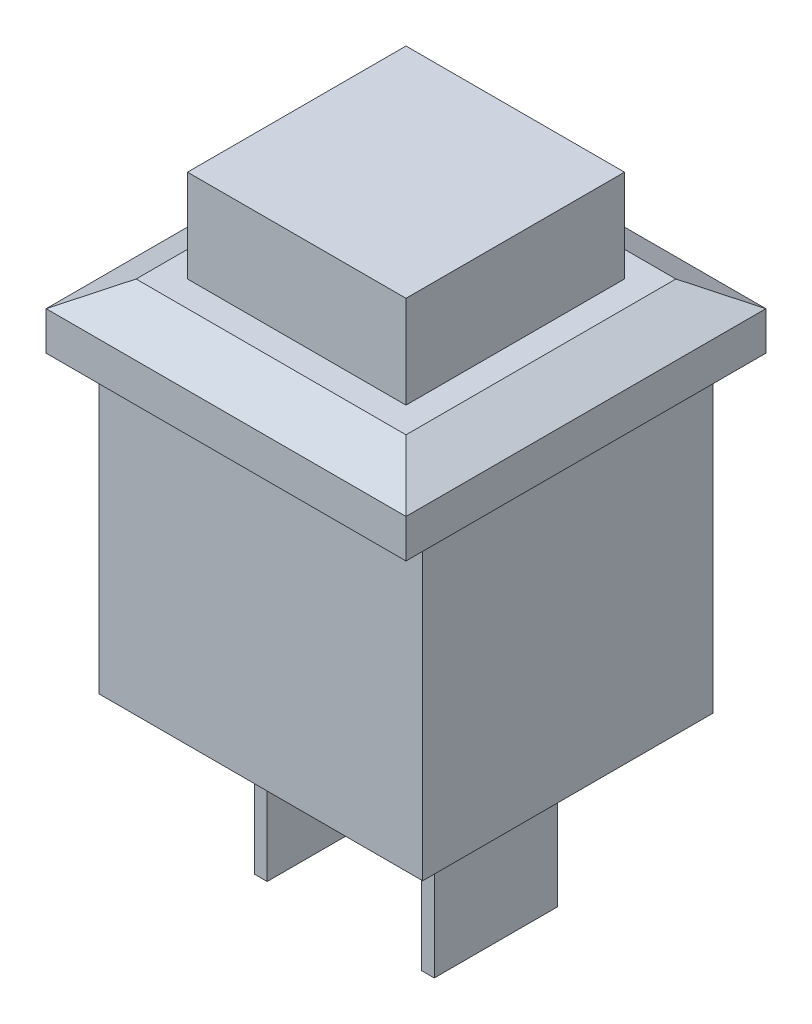
ISO-10303-21;
HEADER;
FILE_DESCRIPTION(('STEP AP214'),'2;1');
FILE_NAME('part.step','',(''),(''),'','','');
FILE_SCHEMA(('AUTOMOTIVE_DESIGN { 1 0 10303 214 1 1 1 1 }'));
ENDSEC;
DATA;
#1=APPLICATION_CONTEXT('core data for automotive mechanical design processes');
#2=APPLICATION_PROTOCOL_DEFINITION('international standard','automotive_design',2000,#1);
#3=PRODUCT_CONTEXT('',#1,'mechanical');
#4=PRODUCT('Part','Part','',(#3));
#5=PRODUCT_RELATED_PRODUCT_CATEGORY('part','',(#4));
#6=PRODUCT_DEFINITION_FORMATION('','',#4);
#7=PRODUCT_DEFINITION_CONTEXT('part definition',#1,'design');
#8=PRODUCT_DEFINITION('design','',#6,#7);
#9=PRODUCT_DEFINITION_SHAPE('','',#8);
#10=(LENGTH_UNIT() NAMED_UNIT(*) SI_UNIT(.MILLI.,.METRE.));
#11=(NAMED_UNIT(*) PLANE_ANGLE_UNIT() SI_UNIT($,.RADIAN.));
#12=(NAMED_UNIT(*) SI_UNIT($,.STERADIAN.) SOLID_ANGLE_UNIT());
#13=UNCERTAINTY_MEASURE_WITH_UNIT(LENGTH_MEASURE(1.E-05),#10,'distance_accuracy_value','');
#14=(GEOMETRIC_REPRESENTATION_CONTEXT(3) GLOBAL_UNCERTAINTY_ASSIGNED_CONTEXT((#13)) GLOBAL_UNIT_ASSIGNED_CONTEXT((#10,
#11,#12)) REPRESENTATION_CONTEXT('',''));
#15=CARTESIAN_POINT('',(0.,0.,0.));
#16=DIRECTION('',(0.,0.,1.));
#17=DIRECTION('',(1.,0.,0.));
#18=AXIS2_PLACEMENT_3D('',#15,#16,#17);
#19=CARTESIAN_POINT('',(4.25,6.1,-4.25));
#20=DIRECTION('',(-1.,0.,0.));
#21=DIRECTION('',(0.,0.,1.));
#22=AXIS2_PLACEMENT_3D('',#19,#20,#21);
#23=PLANE('',#22);
#24=DIRECTION('',(0.,0.,-1.));
#25=VECTOR('',#24,1.);
#26=CARTESIAN_POINT('',(4.25,2.5,-4.25));
#27=LINE('',#26,#25);
#28=CARTESIAN_POINT('',(4.25,2.5,4.25));
#29=VERTEX_POINT('',#28);
#30=CARTESIAN_POINT('',(4.25,2.5,-4.25));
#31=VERTEX_POINT('',#30);
#32=EDGE_CURVE('E105',#29,#31,#27,.T.);
#33=ORIENTED_EDGE('',*,*,#32,.T.);
#34=DIRECTION('',(0.,-1.,0.));
#35=VECTOR('',#34,1.);
#36=CARTESIAN_POINT('',(4.25,6.1,-4.25));
#37=LINE('',#36,#35);
#38=CARTESIAN_POINT('',(4.25,6.1,-4.25));
#39=VERTEX_POINT('',#38);
#40=EDGE_CURVE('E12',#39,#31,#37,.T.);
#41=ORIENTED_EDGE('',*,*,#40,.F.);
#42=DIRECTION('',(0.,0.,-1.));
#43=VECTOR('',#42,1.);
#44=CARTESIAN_POINT('',(4.25,6.1,-4.25));
#45=LINE('',#44,#43);
#46=CARTESIAN_POINT('',(4.25,6.1,4.25));
#47=VERTEX_POINT('',#46);
#48=EDGE_CURVE('E93',#47,#39,#45,.T.);
#49=ORIENTED_EDGE('',*,*,#48,.F.);
#50=DIRECTION('',(0.,-1.,0.));
#51=VECTOR('',#50,1.);
#52=CARTESIAN_POINT('',(4.25,6.1,4.25));
#53=LINE('',#52,#51);
#54=EDGE_CURVE('E101',#47,#29,#53,.T.);
#55=ORIENTED_EDGE('',*,*,#54,.T.);
#56=EDGE_LOOP('',(#33,#41,#49,#55));
#57=FACE_BOUND('',#56,.T.);
#58=ADVANCED_FACE('F42',(#57),#23,.F.);
#59=CARTESIAN_POINT('',(-4.25,6.1,-4.25));
#60=DIRECTION('',(0.,0.,1.));
#61=DIRECTION('',(1.,0.,0.));
#62=AXIS2_PLACEMENT_3D('',#59,#60,#61);
#63=PLANE('',#62);
#64=DIRECTION('',(-1.,0.,0.));
#65=VECTOR('',#64,1.);
#66=CARTESIAN_POINT('',(-4.25,2.5,-4.25));
#67=LINE('',#66,#65);
#68=CARTESIAN_POINT('',(-4.25,2.5,-4.25));
#69=VERTEX_POINT('',#68);
#70=EDGE_CURVE('E97',#31,#69,#67,.T.);
#71=ORIENTED_EDGE('',*,*,#70,.T.);
#72=DIRECTION('',(0.,-1.,0.));
#73=VECTOR('',#72,1.);
#74=CARTESIAN_POINT('',(-4.25,6.1,-4.25));
#75=LINE('',#74,#73);
#76=CARTESIAN_POINT('',(-4.25,6.1,-4.25));
#77=VERTEX_POINT('',#76);
#78=EDGE_CURVE('E50',#77,#69,#75,.T.);
#79=ORIENTED_EDGE('',*,*,#78,.F.);
#80=DIRECTION('',(-1.,0.,0.));
#81=VECTOR('',#80,1.);
#82=CARTESIAN_POINT('',(-4.25,6.1,-4.25));
#83=LINE('',#82,#81);
#84=EDGE_CURVE('E88',#39,#77,#83,.T.);
#85=ORIENTED_EDGE('',*,*,#84,.F.);
#86=ORIENTED_EDGE('',*,*,#40,.T.);
#87=EDGE_LOOP('',(#71,#79,#85,#86));
#88=FACE_BOUND('',#87,.T.);
#89=ADVANCED_FACE('F96',(#88),#63,.F.);
#90=CARTESIAN_POINT('',(-4.25,6.1,-4.25));
#91=DIRECTION('',(1.,0.,0.));
#92=DIRECTION('',(0.,0.,-1.));
#93=AXIS2_PLACEMENT_3D('',#90,#91,#92);
#94=PLANE('',#93);
#95=DIRECTION('',(0.,0.,1.));
#96=VECTOR('',#95,1.);
#97=CARTESIAN_POINT('',(-4.25,2.5,-4.25));
#98=LINE('',#97,#96);
#99=CARTESIAN_POINT('',(-4.25,2.5,4.25));
#100=VERTEX_POINT('',#99);
#101=EDGE_CURVE('E75',#69,#100,#98,.T.);
#102=ORIENTED_EDGE('',*,*,#101,.T.);
#103=DIRECTION('',(0.,-1.,0.));
#104=VECTOR('',#103,1.);
#105=CARTESIAN_POINT('',(-4.25,6.1,4.25));
#106=LINE('',#105,#104);
#107=CARTESIAN_POINT('',(-4.25,6.1,4.25));
#108=VERTEX_POINT('',#107);
#109=EDGE_CURVE('E98',#108,#100,#106,.T.);
#110=ORIENTED_EDGE('',*,*,#109,.F.);
#111=DIRECTION('',(0.,0.,1.));
#112=VECTOR('',#111,1.);
#113=CARTESIAN_POINT('',(-4.25,6.1,-4.25));
#114=LINE('',#113,#112);
#115=EDGE_CURVE('E91',#77,#108,#114,.T.);
#116=ORIENTED_EDGE('',*,*,#115,.F.);
#117=ORIENTED_EDGE('',*,*,#78,.T.);
#118=EDGE_LOOP('',(#102,#110,#116,#117));
#119=FACE_BOUND('',#118,.T.);
#120=ADVANCED_FACE('F99',(#119),#94,.F.);
#121=CARTESIAN_POINT('',(-4.25,6.1,4.25));
#122=DIRECTION('',(0.,0.,-1.));
#123=DIRECTION('',(-1.,0.,0.));
#124=AXIS2_PLACEMENT_3D('',#121,#122,#123);
#125=PLANE('',#124);
#126=DIRECTION('',(1.,0.,0.));
#127=VECTOR('',#126,1.);
#128=CARTESIAN_POINT('',(-4.25,2.5,4.25));
#129=LINE('',#128,#127);
#130=EDGE_CURVE('E81',#100,#29,#129,.T.);
#131=ORIENTED_EDGE('',*,*,#130,.T.);
#132=ORIENTED_EDGE('',*,*,#54,.F.);
#133=DIRECTION('',(1.,0.,0.));
#134=VECTOR('',#133,1.);
#135=CARTESIAN_POINT('',(-4.25,6.1,4.25));
#136=LINE('',#135,#134);
#137=EDGE_CURVE('E58',#108,#47,#136,.T.);
#138=ORIENTED_EDGE('',*,*,#137,.F.);
#139=ORIENTED_EDGE('',*,*,#109,.T.);
#140=EDGE_LOOP('',(#131,#132,#138,#139));
#141=FACE_BOUND('',#140,.T.);
#142=ADVANCED_FACE('F112',(#141),#125,.F.);
#143=CARTESIAN_POINT('',(0.,6.1,0.));
#144=DIRECTION('',(0.,1.,0.));
#145=DIRECTION('',(0.,0.,1.));
#146=AXIS2_PLACEMENT_3D('',#143,#144,#145);
#147=PLANE('',#146);
#148=ORIENTED_EDGE('',*,*,#48,.T.);
#149=ORIENTED_EDGE('',*,*,#84,.T.);
#150=ORIENTED_EDGE('',*,*,#115,.T.);
#151=ORIENTED_EDGE('',*,*,#137,.T.);
#152=EDGE_LOOP('',(#148,#149,#150,#151));
#153=FACE_BOUND('',#152,.T.);
#154=ADVANCED_FACE('F89',(#153),#147,.T.);
#155=CARTESIAN_POINT('',(0.,2.5,0.));
#156=DIRECTION('',(0.,1.,0.));
#157=DIRECTION('',(0.,0.,1.));
#158=AXIS2_PLACEMENT_3D('',#155,#156,#157);
#159=PLANE('',#158);
#160=ORIENTED_EDGE('',*,*,#32,.F.);
#161=ORIENTED_EDGE('',*,*,#130,.F.);
#162=ORIENTED_EDGE('',*,*,#101,.F.);
#163=ORIENTED_EDGE('',*,*,#70,.F.);
#164=EDGE_LOOP('',(#160,#161,#162,#163));
#165=FACE_BOUND('',#164,.T.);
#166=ADVANCED_FACE('F115',(#165),#159,.F.);
#167=CLOSED_SHELL('',(#58,#89,#120,#142,#154,#166));
#168=MANIFOLD_SOLID_BREP('B2',#167);
#169=CARTESIAN_POINT('',(0.,-11.8,0.));
#170=DIRECTION('',(0.,-1.,0.));
#171=DIRECTION('',(0.,0.,-1.));
#172=AXIS2_PLACEMENT_3D('',#169,#170,#171);
#173=PLANE('',#172);
#174=DIRECTION('',(-1.,0.,0.));
#175=VECTOR('',#174,1.);
#176=CARTESIAN_POINT('',(-3.5,-11.8,2.4));
#177=LINE('',#176,#175);
#178=CARTESIAN_POINT('',(-3.,-11.8,2.4));
#179=VERTEX_POINT('',#178);
#180=CARTESIAN_POINT('',(-3.5,-11.8,2.4));
#181=VERTEX_POINT('',#180);
#182=EDGE_CURVE('E320',#179,#181,#177,.T.);
#183=ORIENTED_EDGE('',*,*,#182,.F.);
#184=DIRECTION('',(0.,0.,1.));
#185=VECTOR('',#184,1.);
#186=CARTESIAN_POINT('',(-3.,-11.8,-2.4));
#187=LINE('',#186,#185);
#188=CARTESIAN_POINT('',(-3.,-11.8,-2.4));
#189=VERTEX_POINT('',#188);
#190=EDGE_CURVE('E317',#189,#179,#187,.T.);
#191=ORIENTED_EDGE('',*,*,#190,.F.);
#192=DIRECTION('',(1.,0.,0.));
#193=VECTOR('',#192,1.);
#194=CARTESIAN_POINT('',(-3.5,-11.8,-2.4));
#195=LINE('',#194,#193);
#196=CARTESIAN_POINT('',(-3.5,-11.8,-2.4));
#197=VERTEX_POINT('',#196);
#198=EDGE_CURVE('E329',#197,#189,#195,.T.);
#199=ORIENTED_EDGE('',*,*,#198,.F.);
#200=DIRECTION('',(0.,0.,-1.));
#201=VECTOR('',#200,1.);
#202=CARTESIAN_POINT('',(-3.5,-11.8,-2.4));
#203=LINE('',#202,#201);
#204=EDGE_CURVE('E337',#181,#197,#203,.T.);
#205=ORIENTED_EDGE('',*,*,#204,.F.);
#206=EDGE_LOOP('',(#183,#191,#199,#205));
#207=FACE_BOUND('',#206,.T.);
#208=DIRECTION('',(0.,0.,-1.));
#209=VECTOR('',#208,1.);
#210=CARTESIAN_POINT('',(-6.3,-11.8,-5.65));
#211=LINE('',#210,#209);
#212=CARTESIAN_POINT('',(-6.3,-11.8,5.65));
#213=VERTEX_POINT('',#212);
#214=CARTESIAN_POINT('',(-6.3,-11.8,-5.65));
#215=VERTEX_POINT('',#214);
#216=EDGE_CURVE('E349',#213,#215,#211,.T.);
#217=ORIENTED_EDGE('',*,*,#216,.T.);
#218=DIRECTION('',(1.,0.,0.));
#219=VECTOR('',#218,1.);
#220=CARTESIAN_POINT('',(6.3,-11.8,-5.65));
#221=LINE('',#220,#219);
#222=CARTESIAN_POINT('',(6.3,-11.8,-5.65));
#223=VERTEX_POINT('',#222);
#224=EDGE_CURVE('E352',#215,#223,#221,.T.);
#225=ORIENTED_EDGE('',*,*,#224,.T.);
#226=DIRECTION('',(0.,0.,1.));
#227=VECTOR('',#226,1.);
#228=CARTESIAN_POINT('',(6.3,-11.8,-5.65));
#229=LINE('',#228,#227);
#230=CARTESIAN_POINT('',(6.3,-11.8,5.65));
#231=VERTEX_POINT('',#230);
#232=EDGE_CURVE('E355',#223,#231,#229,.T.);
#233=ORIENTED_EDGE('',*,*,#232,.T.);
#234=DIRECTION('',(-1.,0.,0.));
#235=VECTOR('',#234,1.);
#236=CARTESIAN_POINT('',(6.3,-11.8,5.65));
#237=LINE('',#236,#235);
#238=EDGE_CURVE('E357',#231,#213,#237,.T.);
#239=ORIENTED_EDGE('',*,*,#238,.T.);
#240=EDGE_LOOP('',(#217,#225,#233,#239));
#241=FACE_BOUND('',#240,.T.);
#242=DIRECTION('',(0.,0.,1.));
#243=VECTOR('',#242,1.);
#244=CARTESIAN_POINT('',(3.5,-11.8,-2.4));
#245=LINE('',#244,#243);
#246=CARTESIAN_POINT('',(3.5,-11.8,-2.4));
#247=VERTEX_POINT('',#246);
#248=CARTESIAN_POINT('',(3.5,-11.8,2.4));
#249=VERTEX_POINT('',#248);
#250=EDGE_CURVE('E510',#247,#249,#245,.T.);
#251=ORIENTED_EDGE('',*,*,#250,.F.);
#252=DIRECTION('',(1.,0.,0.));
#253=VECTOR('',#252,1.);
#254=CARTESIAN_POINT('',(3.5,-11.8,-2.4));
#255=LINE('',#254,#253);
#256=CARTESIAN_POINT('',(3.,-11.8,-2.4));
#257=VERTEX_POINT('',#256);
#258=EDGE_CURVE('E315',#257,#247,#255,.T.);
#259=ORIENTED_EDGE('',*,*,#258,.F.);
#260=DIRECTION('',(0.,0.,-1.));
#261=VECTOR('',#260,1.);
#262=CARTESIAN_POINT('',(3.,-11.8,-2.4));
#263=LINE('',#262,#261);
#264=CARTESIAN_POINT('',(3.,-11.8,2.4));
#265=VERTEX_POINT('',#264);
#266=EDGE_CURVE('E311',#265,#257,#263,.T.);
#267=ORIENTED_EDGE('',*,*,#266,.F.);
#268=DIRECTION('',(-1.,0.,0.));
#269=VECTOR('',#268,1.);
#270=CARTESIAN_POINT('',(3.5,-11.8,2.4));
#271=LINE('',#270,#269);
#272=EDGE_CURVE('E512',#249,#265,#271,.T.);
#273=ORIENTED_EDGE('',*,*,#272,.F.);
#274=EDGE_LOOP('',(#251,#259,#267,#273));
#275=FACE_BOUND('',#274,.T.);
#276=ADVANCED_FACE('F165',(#207,#241,#275),#173,.T.);
#277=CARTESIAN_POINT('',(0.,0.,0.));
#278=DIRECTION('',(0.,-1.,0.));
#279=DIRECTION('',(0.,0.,-1.));
#280=AXIS2_PLACEMENT_3D('',#277,#278,#279);
#281=PLANE('',#280);
#282=DIRECTION('',(0.,0.,-1.));
#283=VECTOR('',#282,1.);
#284=CARTESIAN_POINT('',(6.99999999999999,0.,7.));
#285=LINE('',#284,#283);
#286=CARTESIAN_POINT('',(6.99999999999999,0.,7.));
#287=VERTEX_POINT('',#286);
#288=CARTESIAN_POINT('',(6.99999999999999,0.,-7.));
#289=VERTEX_POINT('',#288);
#290=EDGE_CURVE('E378',#287,#289,#285,.T.);
#291=ORIENTED_EDGE('',*,*,#290,.F.);
#292=DIRECTION('',(1.,0.,0.));
#293=VECTOR('',#292,1.);
#294=CARTESIAN_POINT('',(-7.00000000000001,0.,7.));
#295=LINE('',#294,#293);
#296=CARTESIAN_POINT('',(-7.00000000000001,0.,7.));
#297=VERTEX_POINT('',#296);
#298=EDGE_CURVE('E387',#297,#287,#295,.T.);
#299=ORIENTED_EDGE('',*,*,#298,.F.);
#300=DIRECTION('',(0.,0.,1.));
#301=VECTOR('',#300,1.);
#302=CARTESIAN_POINT('',(-7.00000000000001,0.,7.));
#303=LINE('',#302,#301);
#304=CARTESIAN_POINT('',(-7.00000000000001,0.,-7.));
#305=VERTEX_POINT('',#304);
#306=EDGE_CURVE('E384',#305,#297,#303,.T.);
#307=ORIENTED_EDGE('',*,*,#306,.F.);
#308=DIRECTION('',(-1.,0.,0.));
#309=VECTOR('',#308,1.);
#310=CARTESIAN_POINT('',(-7.00000000000001,0.,-7.));
#311=LINE('',#310,#309);
#312=EDGE_CURVE('E381',#289,#305,#311,.T.);
#313=ORIENTED_EDGE('',*,*,#312,.F.);
#314=EDGE_LOOP('',(#291,#299,#307,#313));
#315=FACE_BOUND('',#314,.T.);
#316=DIRECTION('',(1.,0.,0.));
#317=VECTOR('',#316,1.);
#318=CARTESIAN_POINT('',(6.3,0.,-5.65));
#319=LINE('',#318,#317);
#320=CARTESIAN_POINT('',(-6.3,0.,-5.65));
#321=VERTEX_POINT('',#320);
#322=CARTESIAN_POINT('',(6.3,0.,-5.65));
#323=VERTEX_POINT('',#322);
#324=EDGE_CURVE('E362',#321,#323,#319,.T.);
#325=ORIENTED_EDGE('',*,*,#324,.F.);
#326=DIRECTION('',(0.,0.,-1.));
#327=VECTOR('',#326,1.);
#328=CARTESIAN_POINT('',(-6.3,0.,-5.65));
#329=LINE('',#328,#327);
#330=CARTESIAN_POINT('',(-6.3,0.,5.65));
#331=VERTEX_POINT('',#330);
#332=EDGE_CURVE('E348',#331,#321,#329,.T.);
#333=ORIENTED_EDGE('',*,*,#332,.F.);
#334=DIRECTION('',(-1.,0.,0.));
#335=VECTOR('',#334,1.);
#336=CARTESIAN_POINT('',(6.3,0.,5.65));
#337=LINE('',#336,#335);
#338=CARTESIAN_POINT('',(6.3,0.,5.65));
#339=VERTEX_POINT('',#338);
#340=EDGE_CURVE('E353',#339,#331,#337,.T.);
#341=ORIENTED_EDGE('',*,*,#340,.F.);
#342=DIRECTION('',(0.,0.,1.));
#343=VECTOR('',#342,1.);
#344=CARTESIAN_POINT('',(6.3,0.,-5.65));
#345=LINE('',#344,#343);
#346=EDGE_CURVE('E364',#323,#339,#345,.T.);
#347=ORIENTED_EDGE('',*,*,#346,.F.);
#348=EDGE_LOOP('',(#325,#333,#341,#347));
#349=FACE_BOUND('',#348,.T.);
#350=ADVANCED_FACE('F442',(#315,#349),#281,.T.);
#351=CARTESIAN_POINT('',(6.99999999999999,2.5,7.));
#352=DIRECTION('',(-1.,0.,0.));
#353=DIRECTION('',(0.,0.,1.));
#354=AXIS2_PLACEMENT_3D('',#351,#352,#353);
#355=PLANE('',#354);
#356=DIRECTION('',(0.,-1.,0.));
#357=VECTOR('',#356,1.);
#358=CARTESIAN_POINT('',(6.99999999999999,2.5,-7.));
#359=LINE('',#358,#357);
#360=CARTESIAN_POINT('',(6.99999999999999,1.5,-7.));
#361=VERTEX_POINT('',#360);
#362=EDGE_CURVE('E396',#361,#289,#359,.T.);
#363=ORIENTED_EDGE('',*,*,#362,.F.);
#364=DIRECTION('',(0.,0.,1.));
#365=VECTOR('',#364,1.);
#366=CARTESIAN_POINT('',(6.99999999999999,1.5,7.));
#367=LINE('',#366,#365);
#368=CARTESIAN_POINT('',(6.99999999999999,1.5,7.));
#369=VERTEX_POINT('',#368);
#370=EDGE_CURVE('E40',#361,#369,#367,.T.);
#371=ORIENTED_EDGE('',*,*,#370,.T.);
#372=DIRECTION('',(0.,-1.,0.));
#373=VECTOR('',#372,1.);
#374=CARTESIAN_POINT('',(6.99999999999999,2.5,7.));
#375=LINE('',#374,#373);
#376=EDGE_CURVE('E390',#369,#287,#375,.T.);
#377=ORIENTED_EDGE('',*,*,#376,.T.);
#378=ORIENTED_EDGE('',*,*,#290,.T.);
#379=EDGE_LOOP('',(#363,#371,#377,#378));
#380=FACE_BOUND('',#379,.T.);
#381=ADVANCED_FACE('F437',(#380),#355,.F.);
#382=CARTESIAN_POINT('',(-7.00000000000001,2.5,-7.));
#383=DIRECTION('',(0.,0.,1.));
#384=DIRECTION('',(1.,0.,0.));
#385=AXIS2_PLACEMENT_3D('',#382,#383,#384);
#386=PLANE('',#385);
#387=DIRECTION('',(0.,-1.,0.));
#388=VECTOR('',#387,1.);
#389=CARTESIAN_POINT('',(-7.00000000000001,2.5,-7.));
#390=LINE('',#389,#388);
#391=CARTESIAN_POINT('',(-7.00000000000001,1.5,-7.));
#392=VERTEX_POINT('',#391);
#393=EDGE_CURVE('E394',#392,#305,#390,.T.);
#394=ORIENTED_EDGE('',*,*,#393,.F.);
#395=DIRECTION('',(1.,0.,0.));
#396=VECTOR('',#395,1.);
#397=CARTESIAN_POINT('',(-7.00000000000001,1.5,-7.));
#398=LINE('',#397,#396);
#399=EDGE_CURVE('E174',#392,#361,#398,.T.);
#400=ORIENTED_EDGE('',*,*,#399,.T.);
#401=ORIENTED_EDGE('',*,*,#362,.T.);
#402=ORIENTED_EDGE('',*,*,#312,.T.);
#403=EDGE_LOOP('',(#394,#400,#401,#402));
#404=FACE_BOUND('',#403,.T.);
#405=ADVANCED_FACE('F434',(#404),#386,.F.);
#406=CARTESIAN_POINT('',(-7.00000000000001,2.5,7.));
#407=DIRECTION('',(1.,0.,0.));
#408=DIRECTION('',(0.,0.,-1.));
#409=AXIS2_PLACEMENT_3D('',#406,#407,#408);
#410=PLANE('',#409);
#411=DIRECTION('',(0.,-1.,0.));
#412=VECTOR('',#411,1.);
#413=CARTESIAN_POINT('',(-7.00000000000001,2.5,7.));
#414=LINE('',#413,#412);
#415=CARTESIAN_POINT('',(-7.00000000000001,1.5,7.));
#416=VERTEX_POINT('',#415);
#417=EDGE_CURVE('E392',#416,#297,#414,.T.);
#418=ORIENTED_EDGE('',*,*,#417,.F.);
#419=DIRECTION('',(0.,0.,-1.));
#420=VECTOR('',#419,1.);
#421=CARTESIAN_POINT('',(-7.00000000000001,1.5,7.));
#422=LINE('',#421,#420);
#423=EDGE_CURVE('E410',#416,#392,#422,.T.);
#424=ORIENTED_EDGE('',*,*,#423,.T.);
#425=ORIENTED_EDGE('',*,*,#393,.T.);
#426=ORIENTED_EDGE('',*,*,#306,.T.);
#427=EDGE_LOOP('',(#418,#424,#425,#426));
#428=FACE_BOUND('',#427,.T.);
#429=ADVANCED_FACE('F447',(#428),#410,.F.);
#430=CARTESIAN_POINT('',(-7.00000000000001,2.5,7.));
#431=DIRECTION('',(0.,0.,-1.));
#432=DIRECTION('',(-1.,0.,0.));
#433=AXIS2_PLACEMENT_3D('',#430,#431,#432);
#434=PLANE('',#433);
#435=ORIENTED_EDGE('',*,*,#376,.F.);
#436=DIRECTION('',(-1.,0.,0.));
#437=VECTOR('',#436,1.);
#438=CARTESIAN_POINT('',(-7.00000000000001,1.5,7.));
#439=LINE('',#438,#437);
#440=EDGE_CURVE('E407',#369,#416,#439,.T.);
#441=ORIENTED_EDGE('',*,*,#440,.T.);
#442=ORIENTED_EDGE('',*,*,#417,.T.);
#443=ORIENTED_EDGE('',*,*,#298,.T.);
#444=EDGE_LOOP('',(#435,#441,#442,#443));
#445=FACE_BOUND('',#444,.T.);
#446=ADVANCED_FACE('F449',(#445),#434,.F.);
#447=CARTESIAN_POINT('',(0.,2.5,0.));
#448=DIRECTION('',(0.,-1.,0.));
#449=DIRECTION('',(0.,0.,-1.));
#450=AXIS2_PLACEMENT_3D('',#447,#448,#449);
#451=PLANE('',#450);
#452=DIRECTION('',(0.,0.,1.));
#453=VECTOR('',#452,1.);
#454=CARTESIAN_POINT('',(-5.24999999999999,2.5,0.));
#455=LINE('',#454,#453);
#456=CARTESIAN_POINT('',(-5.24999999999999,2.5,-5.24999999999999));
#457=VERTEX_POINT('',#456);
#458=CARTESIAN_POINT('',(-5.24999999999999,2.5,5.24999999999999));
#459=VERTEX_POINT('',#458);
#460=EDGE_CURVE('E402',#457,#459,#455,.T.);
#461=ORIENTED_EDGE('',*,*,#460,.T.);
#462=DIRECTION('',(1.,0.,0.));
#463=VECTOR('',#462,1.);
#464=CARTESIAN_POINT('',(0.,2.5,5.24999999999999));
#465=LINE('',#464,#463);
#466=CARTESIAN_POINT('',(5.24999999999998,2.5,5.24999999999999));
#467=VERTEX_POINT('',#466);
#468=EDGE_CURVE('E404',#459,#467,#465,.T.);
#469=ORIENTED_EDGE('',*,*,#468,.T.);
#470=DIRECTION('',(0.,0.,-1.));
#471=VECTOR('',#470,1.);
#472=CARTESIAN_POINT('',(5.24999999999998,2.5,0.));
#473=LINE('',#472,#471);
#474=CARTESIAN_POINT('',(5.24999999999998,2.5,-5.24999999999999));
#475=VERTEX_POINT('',#474);
#476=EDGE_CURVE('E398',#467,#475,#473,.T.);
#477=ORIENTED_EDGE('',*,*,#476,.T.);
#478=DIRECTION('',(-1.,0.,0.));
#479=VECTOR('',#478,1.);
#480=CARTESIAN_POINT('',(0.,2.5,-5.24999999999999));
#481=LINE('',#480,#479);
#482=EDGE_CURVE('E400',#475,#457,#481,.T.);
#483=ORIENTED_EDGE('',*,*,#482,.T.);
#484=EDGE_LOOP('',(#461,#469,#477,#483));
#485=FACE_BOUND('',#484,.T.);
#486=ADVANCED_FACE('F457',(#485),#451,.F.);
#487=CARTESIAN_POINT('',(0.,2.5,-5.24999999999999));
#488=DIRECTION('',(0.,-0.86824314212446,0.496138938356833));
#489=DIRECTION('',(-1.,0.,0.));
#490=AXIS2_PLACEMENT_3D('',#487,#488,#489);
#491=PLANE('',#490);
#492=DIRECTION('',(-0.655610068107186,0.374634324632677,0.655610068107186));
#493=VECTOR('',#492,1.);
#494=CARTESIAN_POINT('',(2.99342105263157,3.78947368421052,-2.99342105263157));
#495=LINE('',#494,#493);
#496=EDGE_CURVE('E415',#361,#475,#495,.T.);
#497=ORIENTED_EDGE('',*,*,#496,.F.);
#498=ORIENTED_EDGE('',*,*,#399,.F.);
#499=DIRECTION('',(0.655610068107186,0.374634324632677,0.655610068107186));
#500=VECTOR('',#499,1.);
#501=CARTESIAN_POINT('',(-2.99342105263157,3.78947368421052,-2.99342105263157));
#502=LINE('',#501,#500);
#503=EDGE_CURVE('E169',#457,#392,#502,.F.);
#504=ORIENTED_EDGE('',*,*,#503,.F.);
#505=ORIENTED_EDGE('',*,*,#482,.F.);
#506=EDGE_LOOP('',(#497,#498,#504,#505));
#507=FACE_BOUND('',#506,.T.);
#508=ADVANCED_FACE('F167',(#507),#491,.F.);
#509=CARTESIAN_POINT('',(-5.24999999999999,2.5,0.));
#510=DIRECTION('',(0.496138938356833,-0.86824314212446,0.));
#511=DIRECTION('',(0.,0.,1.));
#512=AXIS2_PLACEMENT_3D('',#509,#510,#511);
#513=PLANE('',#512);
#514=ORIENTED_EDGE('',*,*,#503,.T.);
#515=ORIENTED_EDGE('',*,*,#423,.F.);
#516=DIRECTION('',(0.655610068107186,0.374634324632677,-0.655610068107186));
#517=VECTOR('',#516,1.);
#518=CARTESIAN_POINT('',(-2.99342105263158,3.78947368421052,2.99342105263157));
#519=LINE('',#518,#517);
#520=EDGE_CURVE('E414',#459,#416,#519,.F.);
#521=ORIENTED_EDGE('',*,*,#520,.F.);
#522=ORIENTED_EDGE('',*,*,#460,.F.);
#523=EDGE_LOOP('',(#514,#515,#521,#522));
#524=FACE_BOUND('',#523,.T.);
#525=ADVANCED_FACE('F426',(#524),#513,.F.);
#526=CARTESIAN_POINT('',(5.24999999999998,2.5,0.));
#527=DIRECTION('',(-0.496138938356833,-0.86824314212446,0.));
#528=DIRECTION('',(0.,0.,-1.));
#529=AXIS2_PLACEMENT_3D('',#526,#527,#528);
#530=PLANE('',#529);
#531=ORIENTED_EDGE('',*,*,#496,.T.);
#532=ORIENTED_EDGE('',*,*,#476,.F.);
#533=DIRECTION('',(0.655610068107186,-0.374634324632677,0.655610068107186));
#534=VECTOR('',#533,1.);
#535=CARTESIAN_POINT('',(2.99342105263157,3.78947368421052,2.99342105263157));
#536=LINE('',#535,#534);
#537=EDGE_CURVE('E377',#369,#467,#536,.F.);
#538=ORIENTED_EDGE('',*,*,#537,.F.);
#539=ORIENTED_EDGE('',*,*,#370,.F.);
#540=EDGE_LOOP('',(#531,#532,#538,#539));
#541=FACE_BOUND('',#540,.T.);
#542=ADVANCED_FACE('F455',(#541),#530,.F.);
#543=CARTESIAN_POINT('',(0.,2.5,5.24999999999999));
#544=DIRECTION('',(0.,-0.86824314212446,-0.496138938356833));
#545=DIRECTION('',(1.,0.,0.));
#546=AXIS2_PLACEMENT_3D('',#543,#544,#545);
#547=PLANE('',#546);
#548=ORIENTED_EDGE('',*,*,#520,.T.);
#549=ORIENTED_EDGE('',*,*,#440,.F.);
#550=ORIENTED_EDGE('',*,*,#537,.T.);
#551=ORIENTED_EDGE('',*,*,#468,.F.);
#552=EDGE_LOOP('',(#548,#549,#550,#551));
#553=FACE_BOUND('',#552,.T.);
#554=ADVANCED_FACE('F453',(#553),#547,.F.);
#555=CARTESIAN_POINT('',(-6.3,-11.8,-5.65));
#556=DIRECTION('',(1.,0.,0.));
#557=DIRECTION('',(0.,0.,-1.));
#558=AXIS2_PLACEMENT_3D('',#555,#556,#557);
#559=PLANE('',#558);
#560=ORIENTED_EDGE('',*,*,#332,.T.);
#561=DIRECTION('',(0.,1.,0.));
#562=VECTOR('',#561,1.);
#563=CARTESIAN_POINT('',(-6.3,-11.8,-5.65));
#564=LINE('',#563,#562);
#565=EDGE_CURVE('E375',#215,#321,#564,.T.);
#566=ORIENTED_EDGE('',*,*,#565,.F.);
#567=ORIENTED_EDGE('',*,*,#216,.F.);
#568=DIRECTION('',(0.,1.,0.));
#569=VECTOR('',#568,1.);
#570=CARTESIAN_POINT('',(-6.3,-11.8,5.65));
#571=LINE('',#570,#569);
#572=EDGE_CURVE('E359',#213,#331,#571,.T.);
#573=ORIENTED_EDGE('',*,*,#572,.T.);
#574=EDGE_LOOP('',(#560,#566,#567,#573));
#575=FACE_BOUND('',#574,.T.);
#576=ADVANCED_FACE('F489',(#575),#559,.F.);
#577=CARTESIAN_POINT('',(6.3,-11.8,-5.65));
#578=DIRECTION('',(0.,0.,1.));
#579=DIRECTION('',(1.,0.,0.));
#580=AXIS2_PLACEMENT_3D('',#577,#578,#579);
#581=PLANE('',#580);
#582=ORIENTED_EDGE('',*,*,#324,.T.);
#583=DIRECTION('',(0.,1.,0.));
#584=VECTOR('',#583,1.);
#585=CARTESIAN_POINT('',(6.3,-11.8,-5.65));
#586=LINE('',#585,#584);
#587=EDGE_CURVE('E372',#223,#323,#586,.T.);
#588=ORIENTED_EDGE('',*,*,#587,.F.);
#589=ORIENTED_EDGE('',*,*,#224,.F.);
#590=ORIENTED_EDGE('',*,*,#565,.T.);
#591=EDGE_LOOP('',(#582,#588,#589,#590));
#592=FACE_BOUND('',#591,.T.);
#593=ADVANCED_FACE('F486',(#592),#581,.F.);
#594=CARTESIAN_POINT('',(6.3,-11.8,-5.65));
#595=DIRECTION('',(-1.,0.,0.));
#596=DIRECTION('',(0.,0.,1.));
#597=AXIS2_PLACEMENT_3D('',#594,#595,#596);
#598=PLANE('',#597);
#599=ORIENTED_EDGE('',*,*,#346,.T.);
#600=DIRECTION('',(0.,1.,0.));
#601=VECTOR('',#600,1.);
#602=CARTESIAN_POINT('',(6.3,-11.8,5.65));
#603=LINE('',#602,#601);
#604=EDGE_CURVE('E370',#231,#339,#603,.T.);
#605=ORIENTED_EDGE('',*,*,#604,.F.);
#606=ORIENTED_EDGE('',*,*,#232,.F.);
#607=ORIENTED_EDGE('',*,*,#587,.T.);
#608=EDGE_LOOP('',(#599,#605,#606,#607));
#609=FACE_BOUND('',#608,.T.);
#610=ADVANCED_FACE('F482',(#609),#598,.F.);
#611=CARTESIAN_POINT('',(6.3,-11.8,5.65));
#612=DIRECTION('',(0.,0.,-1.));
#613=DIRECTION('',(-1.,0.,0.));
#614=AXIS2_PLACEMENT_3D('',#611,#612,#613);
#615=PLANE('',#614);
#616=ORIENTED_EDGE('',*,*,#340,.T.);
#617=ORIENTED_EDGE('',*,*,#572,.F.);
#618=ORIENTED_EDGE('',*,*,#238,.F.);
#619=ORIENTED_EDGE('',*,*,#604,.T.);
#620=EDGE_LOOP('',(#616,#617,#618,#619));
#621=FACE_BOUND('',#620,.T.);
#622=ADVANCED_FACE('F479',(#621),#615,.F.);
#623=CARTESIAN_POINT('',(-3.,-18.1,-2.4));
#624=DIRECTION('',(-1.,0.,0.));
#625=DIRECTION('',(0.,0.,1.));
#626=AXIS2_PLACEMENT_3D('',#623,#624,#625);
#627=PLANE('',#626);
#628=ORIENTED_EDGE('',*,*,#190,.T.);
#629=DIRECTION('',(0.,1.,0.));
#630=VECTOR('',#629,1.);
#631=CARTESIAN_POINT('',(-3.,-18.1,2.4));
#632=LINE('',#631,#630);
#633=CARTESIAN_POINT('',(-3.,-18.1,2.4));
#634=VERTEX_POINT('',#633);
#635=EDGE_CURVE('E346',#634,#179,#632,.T.);
#636=ORIENTED_EDGE('',*,*,#635,.F.);
#637=DIRECTION('',(0.,0.,1.));
#638=VECTOR('',#637,1.);
#639=CARTESIAN_POINT('',(-3.,-18.1,-2.4));
#640=LINE('',#639,#638);
#641=CARTESIAN_POINT('',(-3.,-18.1,-2.4));
#642=VERTEX_POINT('',#641);
#643=EDGE_CURVE('E325',#642,#634,#640,.T.);
#644=ORIENTED_EDGE('',*,*,#643,.F.);
#645=DIRECTION('',(0.,1.,0.));
#646=VECTOR('',#645,1.);
#647=CARTESIAN_POINT('',(-3.,-18.1,-2.4));
#648=LINE('',#647,#646);
#649=EDGE_CURVE('E334',#642,#189,#648,.T.);
#650=ORIENTED_EDGE('',*,*,#649,.T.);
#651=EDGE_LOOP('',(#628,#636,#644,#650));
#652=FACE_BOUND('',#651,.T.);
#653=ADVANCED_FACE('F477',(#652),#627,.F.);
#654=CARTESIAN_POINT('',(-3.5,-18.1,2.4));
#655=DIRECTION('',(0.,0.,-1.));
#656=DIRECTION('',(-1.,0.,0.));
#657=AXIS2_PLACEMENT_3D('',#654,#655,#656);
#658=PLANE('',#657);
#659=ORIENTED_EDGE('',*,*,#182,.T.);
#660=DIRECTION('',(0.,1.,0.));
#661=VECTOR('',#660,1.);
#662=CARTESIAN_POINT('',(-3.5,-18.1,2.4));
#663=LINE('',#662,#661);
#664=CARTESIAN_POINT('',(-3.5,-18.1,2.4));
#665=VERTEX_POINT('',#664);
#666=EDGE_CURVE('E343',#665,#181,#663,.T.);
#667=ORIENTED_EDGE('',*,*,#666,.F.);
#668=DIRECTION('',(-1.,0.,0.));
#669=VECTOR('',#668,1.);
#670=CARTESIAN_POINT('',(-3.5,-18.1,2.4));
#671=LINE('',#670,#669);
#672=EDGE_CURVE('E328',#634,#665,#671,.T.);
#673=ORIENTED_EDGE('',*,*,#672,.F.);
#674=ORIENTED_EDGE('',*,*,#635,.T.);
#675=EDGE_LOOP('',(#659,#667,#673,#674));
#676=FACE_BOUND('',#675,.T.);
#677=ADVANCED_FACE('F546',(#676),#658,.F.);
#678=CARTESIAN_POINT('',(-3.5,-18.1,-2.4));
#679=DIRECTION('',(1.,0.,0.));
#680=DIRECTION('',(0.,0.,-1.));
#681=AXIS2_PLACEMENT_3D('',#678,#679,#680);
#682=PLANE('',#681);
#683=ORIENTED_EDGE('',*,*,#204,.T.);
#684=DIRECTION('',(0.,1.,0.));
#685=VECTOR('',#684,1.);
#686=CARTESIAN_POINT('',(-3.5,-18.1,-2.4));
#687=LINE('',#686,#685);
#688=CARTESIAN_POINT('',(-3.5,-18.1,-2.4));
#689=VERTEX_POINT('',#688);
#690=EDGE_CURVE('E190',#689,#197,#687,.T.);
#691=ORIENTED_EDGE('',*,*,#690,.F.);
#692=DIRECTION('',(0.,0.,-1.));
#693=VECTOR('',#692,1.);
#694=CARTESIAN_POINT('',(-3.5,-18.1,-2.4));
#695=LINE('',#694,#693);
#696=EDGE_CURVE('E331',#665,#689,#695,.T.);
#697=ORIENTED_EDGE('',*,*,#696,.F.);
#698=ORIENTED_EDGE('',*,*,#666,.T.);
#699=EDGE_LOOP('',(#683,#691,#697,#698));
#700=FACE_BOUND('',#699,.T.);
#701=ADVANCED_FACE('F544',(#700),#682,.F.);
#702=CARTESIAN_POINT('',(-3.5,-18.1,-2.4));
#703=DIRECTION('',(0.,0.,1.));
#704=DIRECTION('',(1.,0.,0.));
#705=AXIS2_PLACEMENT_3D('',#702,#703,#704);
#706=PLANE('',#705);
#707=ORIENTED_EDGE('',*,*,#198,.T.);
#708=ORIENTED_EDGE('',*,*,#649,.F.);
#709=DIRECTION('',(1.,0.,0.));
#710=VECTOR('',#709,1.);
#711=CARTESIAN_POINT('',(-3.5,-18.1,-2.4));
#712=LINE('',#711,#710);
#713=EDGE_CURVE('E333',#689,#642,#712,.T.);
#714=ORIENTED_EDGE('',*,*,#713,.F.);
#715=ORIENTED_EDGE('',*,*,#690,.T.);
#716=EDGE_LOOP('',(#707,#708,#714,#715));
#717=FACE_BOUND('',#716,.T.);
#718=ADVANCED_FACE('F540',(#717),#706,.F.);
#719=CARTESIAN_POINT('',(0.,-18.1,0.));
#720=DIRECTION('',(0.,1.,0.));
#721=DIRECTION('',(0.,0.,1.));
#722=AXIS2_PLACEMENT_3D('',#719,#720,#721);
#723=PLANE('',#722);
#724=ORIENTED_EDGE('',*,*,#643,.T.);
#725=ORIENTED_EDGE('',*,*,#672,.T.);
#726=ORIENTED_EDGE('',*,*,#696,.T.);
#727=ORIENTED_EDGE('',*,*,#713,.T.);
#728=EDGE_LOOP('',(#724,#725,#726,#727));
#729=FACE_BOUND('',#728,.T.);
#730=ADVANCED_FACE('F537',(#729),#723,.F.);
#731=CARTESIAN_POINT('',(3.5,-18.1,-2.4));
#732=DIRECTION('',(0.,0.,1.));
#733=DIRECTION('',(1.,0.,0.));
#734=AXIS2_PLACEMENT_3D('',#731,#732,#733);
#735=PLANE('',#734);
#736=ORIENTED_EDGE('',*,*,#258,.T.);
#737=DIRECTION('',(0.,1.,0.));
#738=VECTOR('',#737,1.);
#739=CARTESIAN_POINT('',(3.5,-18.1,-2.4));
#740=LINE('',#739,#738);
#741=CARTESIAN_POINT('',(3.5,-18.1,-2.4));
#742=VERTEX_POINT('',#741);
#743=EDGE_CURVE('E296',#742,#247,#740,.T.);
#744=ORIENTED_EDGE('',*,*,#743,.F.);
#745=DIRECTION('',(1.,0.,0.));
#746=VECTOR('',#745,1.);
#747=CARTESIAN_POINT('',(3.5,-18.1,-2.4));
#748=LINE('',#747,#746);
#749=CARTESIAN_POINT('',(3.,-18.1,-2.4));
#750=VERTEX_POINT('',#749);
#751=EDGE_CURVE('E303',#750,#742,#748,.T.);
#752=ORIENTED_EDGE('',*,*,#751,.F.);
#753=DIRECTION('',(0.,1.,0.));
#754=VECTOR('',#753,1.);
#755=CARTESIAN_POINT('',(3.,-18.1,-2.4));
#756=LINE('',#755,#754);
#757=EDGE_CURVE('E519',#750,#257,#756,.T.);
#758=ORIENTED_EDGE('',*,*,#757,.T.);
#759=EDGE_LOOP('',(#736,#744,#752,#758));
#760=FACE_BOUND('',#759,.T.);
#761=ADVANCED_FACE('F313',(#760),#735,.F.);
#762=CARTESIAN_POINT('',(3.5,-18.1,-2.4));
#763=DIRECTION('',(-1.,0.,0.));
#764=DIRECTION('',(0.,0.,1.));
#765=AXIS2_PLACEMENT_3D('',#762,#763,#764);
#766=PLANE('',#765);
#767=ORIENTED_EDGE('',*,*,#250,.T.);
#768=DIRECTION('',(0.,1.,0.));
#769=VECTOR('',#768,1.);
#770=CARTESIAN_POINT('',(3.5,-18.1,2.4));
#771=LINE('',#770,#769);
#772=CARTESIAN_POINT('',(3.5,-18.1,2.4));
#773=VERTEX_POINT('',#772);
#774=EDGE_CURVE('E299',#773,#249,#771,.T.);
#775=ORIENTED_EDGE('',*,*,#774,.F.);
#776=DIRECTION('',(0.,0.,1.));
#777=VECTOR('',#776,1.);
#778=CARTESIAN_POINT('',(3.5,-18.1,-2.4));
#779=LINE('',#778,#777);
#780=EDGE_CURVE('E292',#742,#773,#779,.T.);
#781=ORIENTED_EDGE('',*,*,#780,.F.);
#782=ORIENTED_EDGE('',*,*,#743,.T.);
#783=EDGE_LOOP('',(#767,#775,#781,#782));
#784=FACE_BOUND('',#783,.T.);
#785=ADVANCED_FACE('F294',(#784),#766,.F.);
#786=CARTESIAN_POINT('',(3.5,-18.1,2.4));
#787=DIRECTION('',(0.,0.,-1.));
#788=DIRECTION('',(-1.,0.,0.));
#789=AXIS2_PLACEMENT_3D('',#786,#787,#788);
#790=PLANE('',#789);
#791=ORIENTED_EDGE('',*,*,#272,.T.);
#792=DIRECTION('',(0.,1.,0.));
#793=VECTOR('',#792,1.);
#794=CARTESIAN_POINT('',(3.,-18.1,2.4));
#795=LINE('',#794,#793);
#796=CARTESIAN_POINT('',(3.,-18.1,2.4));
#797=VERTEX_POINT('',#796);
#798=EDGE_CURVE('E182',#797,#265,#795,.T.);
#799=ORIENTED_EDGE('',*,*,#798,.F.);
#800=DIRECTION('',(-1.,0.,0.));
#801=VECTOR('',#800,1.);
#802=CARTESIAN_POINT('',(3.5,-18.1,2.4));
#803=LINE('',#802,#801);
#804=EDGE_CURVE('E302',#773,#797,#803,.T.);
#805=ORIENTED_EDGE('',*,*,#804,.F.);
#806=ORIENTED_EDGE('',*,*,#774,.T.);
#807=EDGE_LOOP('',(#791,#799,#805,#806));
#808=FACE_BOUND('',#807,.T.);
#809=ADVANCED_FACE('F522',(#808),#790,.F.);
#810=CARTESIAN_POINT('',(3.,-18.1,-2.4));
#811=DIRECTION('',(1.,0.,0.));
#812=DIRECTION('',(0.,0.,-1.));
#813=AXIS2_PLACEMENT_3D('',#810,#811,#812);
#814=PLANE('',#813);
#815=ORIENTED_EDGE('',*,*,#266,.T.);
#816=ORIENTED_EDGE('',*,*,#757,.F.);
#817=DIRECTION('',(0.,0.,-1.));
#818=VECTOR('',#817,1.);
#819=CARTESIAN_POINT('',(3.,-18.1,-2.4));
#820=LINE('',#819,#818);
#821=EDGE_CURVE('E307',#797,#750,#820,.T.);
#822=ORIENTED_EDGE('',*,*,#821,.F.);
#823=ORIENTED_EDGE('',*,*,#798,.T.);
#824=EDGE_LOOP('',(#815,#816,#822,#823));
#825=FACE_BOUND('',#824,.T.);
#826=ADVANCED_FACE('F523',(#825),#814,.F.);
#827=CARTESIAN_POINT('',(0.,-18.1,0.));
#828=DIRECTION('',(0.,1.,0.));
#829=DIRECTION('',(0.,0.,1.));
#830=AXIS2_PLACEMENT_3D('',#827,#828,#829);
#831=PLANE('',#830);
#832=ORIENTED_EDGE('',*,*,#751,.T.);
#833=ORIENTED_EDGE('',*,*,#780,.T.);
#834=ORIENTED_EDGE('',*,*,#804,.T.);
#835=ORIENTED_EDGE('',*,*,#821,.T.);
#836=EDGE_LOOP('',(#832,#833,#834,#835));
#837=FACE_BOUND('',#836,.T.);
#838=ADVANCED_FACE('F306',(#837),#831,.F.);
#839=CLOSED_SHELL('',(#276,#350,#381,#405,#429,#446,#486,#508,#525,#542,#554,#576,#593,#610,
#622,#653,#677,#701,#718,#730,#761,#785,#809,#826,#838));
#840=MANIFOLD_SOLID_BREP('B6',#839);
#841=ADVANCED_BREP_SHAPE_REPRESENTATION('',(#18,#168,#840),#14);
#842=SHAPE_DEFINITION_REPRESENTATION(#9,#841);
ENDSEC;
END-ISO-10303-21;
